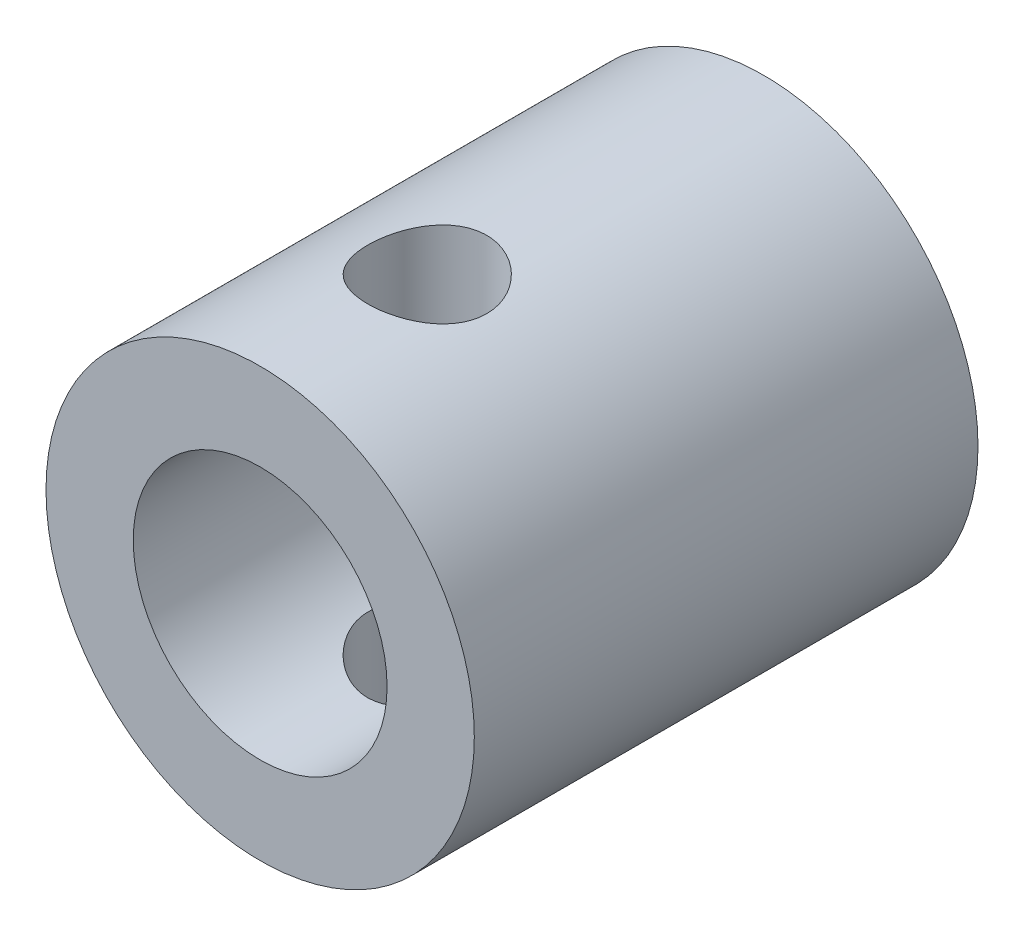
ISO-10303-21;
HEADER;
FILE_DESCRIPTION(('STEP AP214'),'2;1');
FILE_NAME('part.step','',(''),(''),'','','');
FILE_SCHEMA(('AUTOMOTIVE_DESIGN { 1 0 10303 214 1 1 1 1 }'));
ENDSEC;
DATA;
#1=APPLICATION_CONTEXT('core data for automotive mechanical design processes');
#2=APPLICATION_PROTOCOL_DEFINITION('international standard','automotive_design',2000,#1);
#3=PRODUCT_CONTEXT('',#1,'mechanical');
#4=PRODUCT('Part','Part','',(#3));
#5=PRODUCT_RELATED_PRODUCT_CATEGORY('part','',(#4));
#6=PRODUCT_DEFINITION_FORMATION('','',#4);
#7=PRODUCT_DEFINITION_CONTEXT('part definition',#1,'design');
#8=PRODUCT_DEFINITION('design','',#6,#7);
#9=PRODUCT_DEFINITION_SHAPE('','',#8);
#10=(LENGTH_UNIT() NAMED_UNIT(*) SI_UNIT(.MILLI.,.METRE.));
#11=(NAMED_UNIT(*) PLANE_ANGLE_UNIT() SI_UNIT($,.RADIAN.));
#12=(NAMED_UNIT(*) SI_UNIT($,.STERADIAN.) SOLID_ANGLE_UNIT());
#13=UNCERTAINTY_MEASURE_WITH_UNIT(LENGTH_MEASURE(1.E-05),#10,'distance_accuracy_value','');
#14=(GEOMETRIC_REPRESENTATION_CONTEXT(3) GLOBAL_UNCERTAINTY_ASSIGNED_CONTEXT((#13)) GLOBAL_UNIT_ASSIGNED_CONTEXT((#10,
#11,#12)) REPRESENTATION_CONTEXT('',''));
#15=CARTESIAN_POINT('',(0.,0.,0.));
#16=DIRECTION('',(0.,0.,1.));
#17=DIRECTION('',(1.,0.,0.));
#18=AXIS2_PLACEMENT_3D('',#15,#16,#17);
#19=CARTESIAN_POINT('',(0.,-7.3,8.48658298704663));
#20=DIRECTION('',(0.,1.,0.));
#21=DIRECTION('',(0.,0.,1.));
#22=AXIS2_PLACEMENT_3D('',#19,#20,#21);
#23=CYLINDRICAL_SURFACE('',#22,1.5);
#24=CARTESIAN_POINT('',(0.,-3.2,9.98658298704663));
#25=CARTESIAN_POINT('',(0.0794366297653684,-3.19999630571425,9.98657859762955));
#26=CARTESIAN_POINT('',(0.158985054285573,-3.19700957899868,9.98023563033916));
#27=CARTESIAN_POINT('',(0.315767144342182,-3.18535757334793,9.9551272387059));
#28=CARTESIAN_POINT('',(0.392995334806226,-3.17667982118131,9.93633452687561));
#29=CARTESIAN_POINT('',(0.542623613933924,-3.15456154654934,9.88720287511286));
#30=CARTESIAN_POINT('',(0.615040476822122,-3.14113872828529,9.85690682429573));
#31=CARTESIAN_POINT('',(0.753673316550171,-3.11079077785621,9.78583262694887));
#32=CARTESIAN_POINT('',(0.819890295729099,-3.09386621324576,9.7450561787975));
#33=CARTESIAN_POINT('',(0.948350357177736,-3.0570148530726,9.65160791480745));
#34=CARTESIAN_POINT('',(1.01017369872326,-3.03697404361317,9.5984046303423));
#35=CARTESIAN_POINT('',(1.12439785354931,-2.99656590387074,9.48274718235108));
#36=CARTESIAN_POINT('',(1.17679240559473,-2.97619836632648,9.42028692150968));
#37=CARTESIAN_POINT('',(1.27411857201607,-2.93591183357015,9.28292639416869));
#38=CARTESIAN_POINT('',(1.31833010930722,-2.91611100881908,9.20747737079306));
#39=CARTESIAN_POINT('',(1.39325151163875,-2.88107150479241,9.0491702464596));
#40=CARTESIAN_POINT('',(1.4239700636606,-2.86582989225174,8.96631695395662));
#41=CARTESIAN_POINT('',(1.46919263785962,-2.84290120635756,8.8003442664747));
#42=CARTESIAN_POINT('',(1.48450988794257,-2.83483816808474,8.71750075919955));
#43=CARTESIAN_POINT('',(1.50101060360856,-2.82613943112327,8.55005851367278));
#44=CARTESIAN_POINT('',(1.50220525058387,-2.82549785659326,8.46546121713348));
#45=CARTESIAN_POINT('',(1.49102860152934,-2.83140540410836,8.30615536176429));
#46=CARTESIAN_POINT('',(1.48002746065053,-2.83722835518323,8.23131767093712));
#47=CARTESIAN_POINT('',(1.44711565103968,-2.85415400915747,8.08470813173899));
#48=CARTESIAN_POINT('',(1.42520214213451,-2.86525808654715,8.01293708681023));
#49=CARTESIAN_POINT('',(1.37065958454468,-2.89175132581127,7.87249713925752));
#50=CARTESIAN_POINT('',(1.33779469146436,-2.90723355127044,7.80393819961885));
#51=CARTESIAN_POINT('',(1.26245573982023,-2.94073170962085,7.67299995113061));
#52=CARTESIAN_POINT('',(1.21997747050552,-2.95874875147367,7.61062336747961));
#53=CARTESIAN_POINT('',(1.12117144504836,-2.99768064068318,7.4866190219445));
#54=CARTESIAN_POINT('',(1.06383576537821,-3.01869659998738,7.42582348477215));
#55=CARTESIAN_POINT('',(0.939641687550932,-3.05963196112561,7.31438971395293));
#56=CARTESIAN_POINT('',(0.872779758723928,-3.07955095258331,7.2637552630959));
#57=CARTESIAN_POINT('',(0.728323977918189,-3.11693783151282,7.17238969383496));
#58=CARTESIAN_POINT('',(0.650429064841608,-3.13429076469825,7.13208385354987));
#59=CARTESIAN_POINT('',(0.487942227794179,-3.16365420400246,7.06545411614692));
#60=CARTESIAN_POINT('',(0.403355047372972,-3.1756684549702,7.03912041566845));
#61=CARTESIAN_POINT('',(0.236758036703878,-3.19224313378799,7.00312422039401));
#62=CARTESIAN_POINT('',(0.155037856315182,-3.19729898462949,6.99235058403384));
#63=CARTESIAN_POINT('',(-0.00919528809397418,-3.20103907716323,6.98436249527376));
#64=CARTESIAN_POINT('',(-0.0917079278381507,-3.199725822791,6.98714271434418));
#65=CARTESIAN_POINT('',(-0.24939802481789,-3.19117976213987,7.00547377568554));
#66=CARTESIAN_POINT('',(-0.324699508933727,-3.18434450990737,7.02016718145557));
#67=CARTESIAN_POINT('',(-0.471643871417133,-3.16591825802244,7.06062308724404));
#68=CARTESIAN_POINT('',(-0.543286322002911,-3.15432670372993,7.08638687821454));
#69=CARTESIAN_POINT('',(-0.683383574707803,-3.12701756569302,7.14902701364521));
#70=CARTESIAN_POINT('',(-0.751674047016101,-3.11118471264979,7.18621890593177));
#71=CARTESIAN_POINT('',(-0.88128616247221,-3.07698472270414,7.2703142066826));
#72=CARTESIAN_POINT('',(-0.94260472604946,-3.05861647375887,7.31722188110271));
#73=CARTESIAN_POINT('',(-1.06226746295268,-3.01925452981606,7.42423317365126));
#74=CARTESIAN_POINT('',(-1.11986840035393,-2.99817233580377,7.48513714815755));
#75=CARTESIAN_POINT('',(-1.22431969123982,-2.95705916335382,7.61592247354971));
#76=CARTESIAN_POINT('',(-1.27116477824616,-2.93702870357223,7.68580819623542));
#77=CARTESIAN_POINT('',(-1.35418065576862,-2.89971388021075,7.83561094429484));
#78=CARTESIAN_POINT('',(-1.38994353105744,-2.88254332558056,7.9157847171322));
#79=CARTESIAN_POINT('',(-1.4470971383464,-2.85428508393637,8.08208628516874));
#80=CARTESIAN_POINT('',(-1.46850394342155,-2.84319059671076,8.16820730222213));
#81=CARTESIAN_POINT('',(-1.49455896187422,-2.82957416856734,8.3355735824674));
#82=CARTESIAN_POINT('',(-1.50054972888926,-2.82636665307332,8.41655372663462));
#83=CARTESIAN_POINT('',(-1.49937130319663,-2.82699286139304,8.57837929532956));
#84=CARTESIAN_POINT('',(-1.49220590575928,-2.83082455454675,8.65922475197785));
#85=CARTESIAN_POINT('',(-1.46613131656595,-2.84440619852351,8.81221329236418));
#86=CARTESIAN_POINT('',(-1.44813274734754,-2.85369602866639,8.88455704202613));
#87=CARTESIAN_POINT('',(-1.40193210541393,-2.87667309849877,9.02516129959467));
#88=CARTESIAN_POINT('',(-1.37372698279688,-2.89036165246904,9.09342057987579));
#89=CARTESIAN_POINT('',(-1.30578840174151,-2.92171219398703,9.22890115493151));
#90=CARTESIAN_POINT('',(-1.26541393094301,-2.93957763369422,9.29575272283994));
#91=CARTESIAN_POINT('',(-1.17505974072646,-2.97684766005847,9.42214482454444));
#92=CARTESIAN_POINT('',(-1.12507549698614,-2.99625296915541,9.48168189291666));
#93=CARTESIAN_POINT('',(-1.01093776241371,-3.03677948258486,9.59802364103041));
#94=CARTESIAN_POINT('',(-0.945860595498028,-3.05787468390215,9.6539359653186));
#95=CARTESIAN_POINT('',(-0.806562992145147,-3.09753038570267,9.75418618212177));
#96=CARTESIAN_POINT('',(-0.732338206421693,-3.11608967155914,9.79851853738528));
#97=CARTESIAN_POINT('',(-0.576903485633841,-3.14856405697806,9.8738855416523));
#98=CARTESIAN_POINT('',(-0.49572795580457,-3.16250053665866,9.90498160226702));
#99=CARTESIAN_POINT('',(-0.328585281775291,-3.18419214255065,9.95271343261562));
#100=CARTESIAN_POINT('',(-0.242633177608916,-3.19196561184219,9.96939212650416));
#101=CARTESIAN_POINT('',(-0.129990114749172,-3.19746509257475,9.98116805437105));
#102=CARTESIAN_POINT('',(-0.104046547063509,-3.19841374704826,9.98319640960821));
#103=CARTESIAN_POINT('',(-0.052072659255267,-3.19968181283614,9.98590460940991));
#104=CARTESIAN_POINT('',(-0.0260423373483137,-3.20000121112686,9.98658442606388));
#105=CARTESIAN_POINT('',(0.,-3.2,9.98658298704663));
#106=B_SPLINE_CURVE_WITH_KNOTS('',3,(#24,#25,#26,#27,#28,#29,#30,#31,#32,#33,#34,#35,#36,#37,
#38,#39,#40,#41,#42,#43,#44,#45,#46,#47,#48,#49,#50,#51,#52,#53,#54,#55,#56,#57,#58,#59,#60,#61,
#62,#63,#64,#65,#66,#67,#68,#69,#70,#71,#72,#73,#74,#75,#76,#77,#78,#79,#80,#81,#82,#83,#84,#85,
#86,#87,#88,#89,#90,#91,#92,#93,#94,#95,#96,#97,#98,#99,#100,#101,#102,#103,#104,#105),
.UNSPECIFIED.,.T.,.F.,(4,2,2,2,2,2,2,2,2,2,2,2,2,2,2,2,2,2,2,2,2,2,2,2,2,2,2,2,2,2,2,2,2,2,2,2,
2,2,2,2,4),(0.,0.238203501088987,0.476930834285988,0.714776698722001,0.95258404383098,
1.20348916300413,1.45456028706044,1.72218974999842,1.98964665571214,2.24209356207648,
2.49434058339922,2.72088002998001,2.94747846905439,3.17931153510989,3.41124634347932,
3.6686152967309,3.92607988679166,4.1928727405001,4.45947815428198,4.70590077523508,
4.95222652601424,5.18224856612757,5.41229743710968,5.64937682702354,5.88656053405105,
6.14473054024122,6.40302668810358,6.66993374182532,6.93654146493568,7.1789957704764,
7.4213801441569,7.64578370611674,7.87025437934697,8.1096266208682,8.34911183707249,
8.6129314932358,8.87687707137173,9.13958432454605,9.40150671085486,9.47959722860009,
9.55768936255934),.UNSPECIFIED.);
#107=CARTESIAN_POINT('',(0.,-3.2,9.98658298704663));
#108=VERTEX_POINT('',#107);
#109=EDGE_CURVE('E36',#108,#108,#106,.T.);
#110=ORIENTED_EDGE('',*,*,#109,.T.);
#111=EDGE_LOOP('',(#110));
#112=FACE_BOUND('',#111,.T.);
#113=CARTESIAN_POINT('',(0.,-5.4,9.98658298704663));
#114=CARTESIAN_POINT('',(0.082561501059815,-5.39999889620314,9.98658130754436));
#115=CARTESIAN_POINT('',(0.1651405485032,-5.39808808904196,9.97974380328028));
#116=CARTESIAN_POINT('',(0.327911371193086,-5.39065140237886,9.95262811312825));
#117=CARTESIAN_POINT('',(0.408102124396127,-5.38512399779114,9.93234425699016));
#118=CARTESIAN_POINT('',(0.563723939616361,-5.37106278473503,9.87905252374993));
#119=CARTESIAN_POINT('',(0.639161268114802,-5.36253303637116,9.84606182460855));
#120=CARTESIAN_POINT('',(0.783432834290128,-5.34336375098435,9.76835877945438));
#121=CARTESIAN_POINT('',(0.852266484974763,-5.33272402666575,9.72364539274347));
#122=CARTESIAN_POINT('',(0.983096141659102,-5.31018189380835,9.62258766643525));
#123=CARTESIAN_POINT('',(1.04490373537014,-5.29825648347858,9.56600453942177));
#124=CARTESIAN_POINT('',(1.15828582283563,-5.27463128541284,9.44332345450053));
#125=CARTESIAN_POINT('',(1.20985887701474,-5.26293152962575,9.37722416031564));
#126=CARTESIAN_POINT('',(1.30224970296378,-5.24084453151262,9.23585427489218));
#127=CARTESIAN_POINT('',(1.34284649937368,-5.2304861752692,9.16043433691691));
#128=CARTESIAN_POINT('',(1.41070748557405,-5.21259480978224,9.00350468587575));
#129=CARTESIAN_POINT('',(1.43797436803628,-5.2050612299994,8.9219962065466));
#130=CARTESIAN_POINT('',(1.47773909241615,-5.19391059741305,8.75729964042328));
#131=CARTESIAN_POINT('',(1.49058044284924,-5.19020263092727,8.67420080109848));
#132=CARTESIAN_POINT('',(1.50220112493309,-5.1868517915112,8.5069519243954));
#133=CARTESIAN_POINT('',(1.50098332832776,-5.18720808840779,8.42280210519971));
#134=CARTESIAN_POINT('',(1.48479205605216,-5.19186440190074,8.25855625257777));
#135=CARTESIAN_POINT('',(1.47023882724825,-5.19604392809897,8.17841482525074));
#136=CARTESIAN_POINT('',(1.42846477442267,-5.20768220456576,8.02175863273715));
#137=CARTESIAN_POINT('',(1.40124286148584,-5.21514123671562,7.94524417992404));
#138=CARTESIAN_POINT('',(1.33457247761364,-5.23260083732974,7.79694030930018));
#139=CARTESIAN_POINT('',(1.29498026204391,-5.24263102320792,7.72521914687454));
#140=CARTESIAN_POINT('',(1.20479328815561,-5.26408740820604,7.58929309633717));
#141=CARTESIAN_POINT('',(1.15419619954872,-5.27551390277027,7.52508980457528));
#142=CARTESIAN_POINT('',(1.04130673234133,-5.2989728655235,7.40362633052292));
#143=CARTESIAN_POINT('',(0.978662735642829,-5.31101244045391,7.34669382519081));
#144=CARTESIAN_POINT('',(0.844567928641242,-5.33397839772952,7.24407211011326));
#145=CARTESIAN_POINT('',(0.773116710506358,-5.34490472848142,7.19838342132366));
#146=CARTESIAN_POINT('',(0.622900115205738,-5.36449007655318,7.11938480829054));
#147=CARTESIAN_POINT('',(0.544099674897298,-5.37313738374641,7.08613846231995));
#148=CARTESIAN_POINT('',(0.381731986523659,-5.38710591001732,7.03346206891699));
#149=CARTESIAN_POINT('',(0.298165876945357,-5.39242791988439,7.01402873645875));
#150=CARTESIAN_POINT('',(0.13143192925577,-5.39902483780091,6.99005442291186));
#151=CARTESIAN_POINT('',(0.0483327670304171,-5.40042064588836,6.98506841315803));
#152=CARTESIAN_POINT('',(-0.117515916763881,-5.39935776351791,6.98889538499755));
#153=CARTESIAN_POINT('',(-0.200265476741422,-5.39689950813801,6.99770680902429));
#154=CARTESIAN_POINT('',(-0.361448296165032,-5.38848318070834,7.02851498799019));
#155=CARTESIAN_POINT('',(-0.439933545796641,-5.38259204601097,7.05025972111566));
#156=CARTESIAN_POINT('',(-0.592131741742465,-5.36798195003225,7.10602122821235));
#157=CARTESIAN_POINT('',(-0.665844148766858,-5.35926266986156,7.14003938613004));
#158=CARTESIAN_POINT('',(-0.8081041684865,-5.3396848834101,7.22018204070242));
#159=CARTESIAN_POINT('',(-0.87651247434425,-5.32878565608678,7.26654361623383));
#160=CARTESIAN_POINT('',(-1.0047332047044,-5.30610572553855,7.36976235001559));
#161=CARTESIAN_POINT('',(-1.06454377755765,-5.29432483326227,7.42662176312555));
#162=CARTESIAN_POINT('',(-1.17577443233394,-5.27075811221255,7.55130471970065));
#163=CARTESIAN_POINT('',(-1.22687949462459,-5.25898329849552,7.61941192891571));
#164=CARTESIAN_POINT('',(-1.3169469771481,-5.2371563196512,7.76348775250231));
#165=CARTESIAN_POINT('',(-1.35590986178956,-5.22710408864596,7.83945606605775));
#166=CARTESIAN_POINT('',(-1.42029727000984,-5.20997758747408,7.99675159090643));
#167=CARTESIAN_POINT('',(-1.44579692981739,-5.20288683715248,8.0780461523522));
#168=CARTESIAN_POINT('',(-1.48269182994428,-5.1924945227134,8.24400263834675));
#169=CARTESIAN_POINT('',(-1.49409105487888,-5.18919188813864,8.32866360460637));
#170=CARTESIAN_POINT('',(-1.50221831969186,-5.1868444599585,8.49570992243557));
#171=CARTESIAN_POINT('',(-1.49945485217498,-5.18765208553412,8.57806881506096));
#172=CARTESIAN_POINT('',(-1.4805257194471,-5.19308564462548,8.74109685960025));
#173=CARTESIAN_POINT('',(-1.46436045659293,-5.1977114635091,8.82176606216852));
#174=CARTESIAN_POINT('',(-1.41939269098337,-5.21016862569603,8.97842366774831));
#175=CARTESIAN_POINT('',(-1.39070657569341,-5.2179704029593,9.05444799822394));
#176=CARTESIAN_POINT('',(-1.32160142004881,-5.23589899262465,9.20066389405542));
#177=CARTESIAN_POINT('',(-1.28118040030426,-5.24602619720885,9.27085447282946));
#178=CARTESIAN_POINT('',(-1.18824835442517,-5.26786572942455,9.40581617043684));
#179=CARTESIAN_POINT('',(-1.13539450121552,-5.27961814778714,9.4703447590659));
#180=CARTESIAN_POINT('',(-1.0197378329408,-5.30316998291235,9.58978183351078));
#181=CARTESIAN_POINT('',(-0.95693255475383,-5.31496941060373,9.64468793051581));
#182=CARTESIAN_POINT('',(-0.821352278769459,-5.33762207497858,9.74461275094033));
#183=CARTESIAN_POINT('',(-0.748375510718609,-5.3484460943135,9.78936493501945));
#184=CARTESIAN_POINT('',(-0.595634379231409,-5.36759969880726,9.865896754194));
#185=CARTESIAN_POINT('',(-0.515874036212069,-5.37593074842403,9.89768400934386));
#186=CARTESIAN_POINT('',(-0.363774580520039,-5.3881928979834,9.94364708392827));
#187=CARTESIAN_POINT('',(-0.292037282602488,-5.39258694794226,9.95970873215808));
#188=CARTESIAN_POINT('',(-0.14687115083209,-5.39849081971542,9.98117680203368));
#189=CARTESIAN_POINT('',(-0.0734425176232979,-5.40000098188162,9.98658448104654));
#190=CARTESIAN_POINT('',(0.,-5.4,9.98658298704663));
#191=B_SPLINE_CURVE_WITH_KNOTS('',3,(#113,#114,#115,#116,#117,#118,#119,#120,#121,#122,#123,
#124,#125,#126,#127,#128,#129,#130,#131,#132,#133,#134,#135,#136,#137,#138,#139,#140,#141,#142,
#143,#144,#145,#146,#147,#148,#149,#150,#151,#152,#153,#154,#155,#156,#157,#158,#159,#160,#161,
#162,#163,#164,#165,#166,#167,#168,#169,#170,#171,#172,#173,#174,#175,#176,#177,#178,#179,#180,
#181,#182,#183,#184,#185,#186,#187,#188,#189,#190),.UNSPECIFIED.,.T.,.F.,(4,2,2,2,2,2,2,2,2,2,2,
2,2,2,2,2,2,2,2,2,2,2,2,2,2,2,2,2,2,2,2,2,2,2,2,2,2,2,4),(0.,0.247415031719389,
0.494934463376713,0.742120449531425,0.989328387405518,1.24209149190317,1.49489012452794,
1.75245228388406,2.00996239360061,2.26120118329619,2.51238865546227,2.7559227959376,
2.99947787284238,3.24597552054041,3.49252541516464,3.74783392611048,4.00315426395029,
4.25976198768393,4.51630866425262,4.76486412711366,5.01339153303427,5.25722780978238,
5.501091590009,5.75002738666326,5.99901671526411,6.25567190048675,6.51231726807094,
6.7675147783002,7.02264015625974,7.26867119098423,7.51469483948312,7.75847872272484,
8.00230375023008,8.25386295933779,8.50548453053998,8.76309708706933,9.02055801451316,
9.2406718383529,9.46075968309975),.UNSPECIFIED.);
#192=CARTESIAN_POINT('',(0.,-5.4,9.98658298704663));
#193=VERTEX_POINT('',#192);
#194=EDGE_CURVE('E57',#193,#193,#191,.T.);
#195=ORIENTED_EDGE('',*,*,#194,.F.);
#196=EDGE_LOOP('',(#195));
#197=FACE_BOUND('',#196,.T.);
#198=ADVANCED_FACE('F31',(#112,#197),#23,.F.);
#199=CARTESIAN_POINT('',(0.,0.,12.7));
#200=DIRECTION('',(0.,0.,-1.));
#201=DIRECTION('',(-1.,0.,0.));
#202=AXIS2_PLACEMENT_3D('',#199,#200,#201);
#203=CYLINDRICAL_SURFACE('',#202,5.4);
#204=ORIENTED_EDGE('',*,*,#194,.T.);
#205=EDGE_LOOP('',(#204));
#206=FACE_BOUND('',#205,.T.);
#207=CARTESIAN_POINT('',(0.,5.4,9.98658298704663));
#208=CARTESIAN_POINT('',(-0.082561501059815,5.39999889620314,9.98658130754436));
#209=CARTESIAN_POINT('',(-0.1651405485032,5.39808808904196,9.97974380328028));
#210=CARTESIAN_POINT('',(-0.327911371193086,5.39065140237886,9.95262811312825));
#211=CARTESIAN_POINT('',(-0.408102124396127,5.38512399779114,9.93234425699016));
#212=CARTESIAN_POINT('',(-0.563723939616361,5.37106278473503,9.87905252374993));
#213=CARTESIAN_POINT('',(-0.639161268114802,5.36253303637116,9.84606182460855));
#214=CARTESIAN_POINT('',(-0.783432834290128,5.34336375098435,9.76835877945438));
#215=CARTESIAN_POINT('',(-0.852266484974763,5.33272402666575,9.72364539274347));
#216=CARTESIAN_POINT('',(-0.983096141659102,5.31018189380835,9.62258766643525));
#217=CARTESIAN_POINT('',(-1.04490373537014,5.29825648347858,9.56600453942177));
#218=CARTESIAN_POINT('',(-1.15828582283563,5.27463128541284,9.44332345450053));
#219=CARTESIAN_POINT('',(-1.20985887701474,5.26293152962575,9.37722416031564));
#220=CARTESIAN_POINT('',(-1.30224970296378,5.24084453151262,9.23585427489218));
#221=CARTESIAN_POINT('',(-1.34284649937368,5.2304861752692,9.16043433691691));
#222=CARTESIAN_POINT('',(-1.41070748557405,5.21259480978224,9.00350468587575));
#223=CARTESIAN_POINT('',(-1.43797436803628,5.2050612299994,8.9219962065466));
#224=CARTESIAN_POINT('',(-1.47773909241615,5.19391059741305,8.75729964042328));
#225=CARTESIAN_POINT('',(-1.49058044284924,5.19020263092727,8.67420080109848));
#226=CARTESIAN_POINT('',(-1.50220112493309,5.1868517915112,8.5069519243954));
#227=CARTESIAN_POINT('',(-1.50098332832776,5.18720808840779,8.42280210519971));
#228=CARTESIAN_POINT('',(-1.48479205605216,5.19186440190074,8.25855625257777));
#229=CARTESIAN_POINT('',(-1.47023882724825,5.19604392809897,8.17841482525074));
#230=CARTESIAN_POINT('',(-1.42846477442267,5.20768220456576,8.02175863273715));
#231=CARTESIAN_POINT('',(-1.40124286148584,5.21514123671562,7.94524417992404));
#232=CARTESIAN_POINT('',(-1.33457247761364,5.23260083732974,7.79694030930018));
#233=CARTESIAN_POINT('',(-1.29498026204391,5.24263102320792,7.72521914687454));
#234=CARTESIAN_POINT('',(-1.20479328815561,5.26408740820604,7.58929309633717));
#235=CARTESIAN_POINT('',(-1.15419619954872,5.27551390277027,7.52508980457528));
#236=CARTESIAN_POINT('',(-1.04130673234133,5.2989728655235,7.40362633052292));
#237=CARTESIAN_POINT('',(-0.978662735642829,5.31101244045391,7.34669382519081));
#238=CARTESIAN_POINT('',(-0.844567928641242,5.33397839772952,7.24407211011326));
#239=CARTESIAN_POINT('',(-0.773116710506358,5.34490472848142,7.19838342132366));
#240=CARTESIAN_POINT('',(-0.622900115205738,5.36449007655318,7.11938480829054));
#241=CARTESIAN_POINT('',(-0.544099674897298,5.37313738374641,7.08613846231995));
#242=CARTESIAN_POINT('',(-0.381731986523659,5.38710591001732,7.03346206891699));
#243=CARTESIAN_POINT('',(-0.298165876945357,5.39242791988439,7.01402873645875));
#244=CARTESIAN_POINT('',(-0.13143192925577,5.39902483780091,6.99005442291186));
#245=CARTESIAN_POINT('',(-0.0483327670304171,5.40042064588836,6.98506841315803));
#246=CARTESIAN_POINT('',(0.117515916763881,5.39935776351791,6.98889538499755));
#247=CARTESIAN_POINT('',(0.200265476741422,5.39689950813801,6.99770680902429));
#248=CARTESIAN_POINT('',(0.361448296165032,5.38848318070834,7.02851498799019));
#249=CARTESIAN_POINT('',(0.439933545796641,5.38259204601097,7.05025972111566));
#250=CARTESIAN_POINT('',(0.592131741742465,5.36798195003225,7.10602122821235));
#251=CARTESIAN_POINT('',(0.665844148766858,5.35926266986156,7.14003938613004));
#252=CARTESIAN_POINT('',(0.8081041684865,5.3396848834101,7.22018204070242));
#253=CARTESIAN_POINT('',(0.87651247434425,5.32878565608678,7.26654361623383));
#254=CARTESIAN_POINT('',(1.0047332047044,5.30610572553855,7.36976235001559));
#255=CARTESIAN_POINT('',(1.06454377755765,5.29432483326227,7.42662176312555));
#256=CARTESIAN_POINT('',(1.17577443233394,5.27075811221255,7.55130471970065));
#257=CARTESIAN_POINT('',(1.22687949462459,5.25898329849552,7.61941192891571));
#258=CARTESIAN_POINT('',(1.3169469771481,5.2371563196512,7.76348775250231));
#259=CARTESIAN_POINT('',(1.35590986178956,5.22710408864596,7.83945606605775));
#260=CARTESIAN_POINT('',(1.42029727000984,5.20997758747408,7.99675159090643));
#261=CARTESIAN_POINT('',(1.44579692981739,5.20288683715248,8.0780461523522));
#262=CARTESIAN_POINT('',(1.48269182994428,5.1924945227134,8.24400263834675));
#263=CARTESIAN_POINT('',(1.49409105487888,5.18919188813864,8.32866360460637));
#264=CARTESIAN_POINT('',(1.50221831969186,5.1868444599585,8.49570992243557));
#265=CARTESIAN_POINT('',(1.49945485217498,5.18765208553412,8.57806881506096));
#266=CARTESIAN_POINT('',(1.4805257194471,5.19308564462548,8.74109685960025));
#267=CARTESIAN_POINT('',(1.46436045659293,5.1977114635091,8.82176606216852));
#268=CARTESIAN_POINT('',(1.41939269098337,5.21016862569603,8.97842366774831));
#269=CARTESIAN_POINT('',(1.39070657569341,5.2179704029593,9.05444799822394));
#270=CARTESIAN_POINT('',(1.32160142004881,5.23589899262465,9.20066389405542));
#271=CARTESIAN_POINT('',(1.28118040030426,5.24602619720885,9.27085447282946));
#272=CARTESIAN_POINT('',(1.18824835442517,5.26786572942455,9.40581617043684));
#273=CARTESIAN_POINT('',(1.13539450121552,5.27961814778714,9.4703447590659));
#274=CARTESIAN_POINT('',(1.0197378329408,5.30316998291235,9.58978183351078));
#275=CARTESIAN_POINT('',(0.95693255475383,5.31496941060373,9.64468793051581));
#276=CARTESIAN_POINT('',(0.821352278769459,5.33762207497858,9.74461275094033));
#277=CARTESIAN_POINT('',(0.748375510718609,5.3484460943135,9.78936493501945));
#278=CARTESIAN_POINT('',(0.595634379231409,5.36759969880726,9.865896754194));
#279=CARTESIAN_POINT('',(0.515874036212069,5.37593074842403,9.89768400934386));
#280=CARTESIAN_POINT('',(0.363774580520039,5.3881928979834,9.94364708392827));
#281=CARTESIAN_POINT('',(0.292037282602488,5.39258694794226,9.95970873215808));
#282=CARTESIAN_POINT('',(0.14687115083209,5.39849081971542,9.98117680203368));
#283=CARTESIAN_POINT('',(0.0734425176232979,5.40000098188162,9.98658448104654));
#284=CARTESIAN_POINT('',(0.,5.4,9.98658298704663));
#285=B_SPLINE_CURVE_WITH_KNOTS('',3,(#207,#208,#209,#210,#211,#212,#213,#214,#215,#216,#217,
#218,#219,#220,#221,#222,#223,#224,#225,#226,#227,#228,#229,#230,#231,#232,#233,#234,#235,#236,
#237,#238,#239,#240,#241,#242,#243,#244,#245,#246,#247,#248,#249,#250,#251,#252,#253,#254,#255,
#256,#257,#258,#259,#260,#261,#262,#263,#264,#265,#266,#267,#268,#269,#270,#271,#272,#273,#274,
#275,#276,#277,#278,#279,#280,#281,#282,#283,#284),.UNSPECIFIED.,.T.,.F.,(4,2,2,2,2,2,2,2,2,2,2,
2,2,2,2,2,2,2,2,2,2,2,2,2,2,2,2,2,2,2,2,2,2,2,2,2,2,2,4),(0.,0.247415031719389,
0.494934463376713,0.742120449531425,0.989328387405518,1.24209149190317,1.49489012452794,
1.75245228388406,2.00996239360061,2.26120118329619,2.51238865546227,2.7559227959376,
2.99947787284238,3.24597552054041,3.49252541516464,3.74783392611048,4.00315426395029,
4.25976198768393,4.51630866425262,4.76486412711366,5.01339153303427,5.25722780978238,
5.501091590009,5.75002738666326,5.99901671526411,6.25567190048675,6.51231726807094,
6.7675147783002,7.02264015625974,7.26867119098423,7.51469483948312,7.75847872272484,
8.00230375023008,8.25386295933779,8.50548453053998,8.76309708706933,9.02055801451316,
9.2406718383529,9.46075968309975),.UNSPECIFIED.);
#286=CARTESIAN_POINT('',(0.,5.4,9.98658298704663));
#287=VERTEX_POINT('',#286);
#288=EDGE_CURVE('E10',#287,#287,#285,.T.);
#289=ORIENTED_EDGE('',*,*,#288,.T.);
#290=EDGE_LOOP('',(#289));
#291=FACE_BOUND('',#290,.T.);
#292=CARTESIAN_POINT('',(0.,0.,12.7));
#293=DIRECTION('',(0.,0.,1.));
#294=DIRECTION('',(1.,0.,0.));
#295=AXIS2_PLACEMENT_3D('',#292,#293,#294);
#296=CIRCLE('',#295,5.4);
#297=CARTESIAN_POINT('',(5.4,0.,12.7));
#298=VERTEX_POINT('',#297);
#299=EDGE_CURVE('E45',#298,#298,#296,.T.);
#300=ORIENTED_EDGE('',*,*,#299,.F.);
#301=EDGE_LOOP('',(#300));
#302=FACE_BOUND('',#301,.T.);
#303=CARTESIAN_POINT('',(0.,0.,0.));
#304=DIRECTION('',(0.,0.,1.));
#305=DIRECTION('',(1.,0.,0.));
#306=AXIS2_PLACEMENT_3D('',#303,#304,#305);
#307=CIRCLE('',#306,5.4);
#308=CARTESIAN_POINT('',(5.4,0.,0.));
#309=VERTEX_POINT('',#308);
#310=EDGE_CURVE('E50',#309,#309,#307,.T.);
#311=ORIENTED_EDGE('',*,*,#310,.T.);
#312=EDGE_LOOP('',(#311));
#313=FACE_BOUND('',#312,.T.);
#314=ADVANCED_FACE('F33',(#206,#291,#302,#313),#203,.T.);
#315=CARTESIAN_POINT('',(0.,0.,12.7));
#316=DIRECTION('',(0.,0.,1.));
#317=DIRECTION('',(1.,0.,0.));
#318=AXIS2_PLACEMENT_3D('',#315,#316,#317);
#319=PLANE('',#318);
#320=CARTESIAN_POINT('',(0.,0.,12.7));
#321=DIRECTION('',(0.,0.,1.));
#322=DIRECTION('',(1.,0.,0.));
#323=AXIS2_PLACEMENT_3D('',#320,#321,#322);
#324=CIRCLE('',#323,3.2);
#325=CARTESIAN_POINT('',(3.2,0.,12.7));
#326=VERTEX_POINT('',#325);
#327=EDGE_CURVE('E115',#326,#326,#324,.T.);
#328=ORIENTED_EDGE('',*,*,#327,.F.);
#329=EDGE_LOOP('',(#328));
#330=FACE_BOUND('',#329,.T.);
#331=ORIENTED_EDGE('',*,*,#299,.T.);
#332=EDGE_LOOP('',(#331));
#333=FACE_BOUND('',#332,.T.);
#334=ADVANCED_FACE('F69',(#330,#333),#319,.T.);
#335=CARTESIAN_POINT('',(0.,0.,0.));
#336=DIRECTION('',(0.,0.,1.));
#337=DIRECTION('',(1.,0.,0.));
#338=AXIS2_PLACEMENT_3D('',#335,#336,#337);
#339=PLANE('',#338);
#340=CARTESIAN_POINT('',(0.,0.,0.));
#341=DIRECTION('',(0.,0.,-1.));
#342=DIRECTION('',(-1.,0.,0.));
#343=AXIS2_PLACEMENT_3D('',#340,#341,#342);
#344=CIRCLE('',#343,2.25);
#345=CARTESIAN_POINT('',(-2.25,0.,0.));
#346=VERTEX_POINT('',#345);
#347=EDGE_CURVE('E105',#346,#346,#344,.T.);
#348=ORIENTED_EDGE('',*,*,#347,.F.);
#349=EDGE_LOOP('',(#348));
#350=FACE_BOUND('',#349,.T.);
#351=ORIENTED_EDGE('',*,*,#310,.F.);
#352=EDGE_LOOP('',(#351));
#353=FACE_BOUND('',#352,.T.);
#354=ADVANCED_FACE('F67',(#350,#353),#339,.F.);
#355=CARTESIAN_POINT('',(0.,3.2,9.98658298704663));
#356=CARTESIAN_POINT('',(-0.0794366297653684,3.19999630571425,9.98657859762955));
#357=CARTESIAN_POINT('',(-0.158985054285573,3.19700957899868,9.98023563033916));
#358=CARTESIAN_POINT('',(-0.315767144342182,3.18535757334793,9.9551272387059));
#359=CARTESIAN_POINT('',(-0.392995334806226,3.17667982118131,9.93633452687561));
#360=CARTESIAN_POINT('',(-0.542623613933924,3.15456154654934,9.88720287511286));
#361=CARTESIAN_POINT('',(-0.615040476822122,3.14113872828529,9.85690682429573));
#362=CARTESIAN_POINT('',(-0.753673316550171,3.11079077785621,9.78583262694887));
#363=CARTESIAN_POINT('',(-0.819890295729099,3.09386621324576,9.7450561787975));
#364=CARTESIAN_POINT('',(-0.948350357177736,3.0570148530726,9.65160791480745));
#365=CARTESIAN_POINT('',(-1.01017369872326,3.03697404361317,9.5984046303423));
#366=CARTESIAN_POINT('',(-1.12439785354931,2.99656590387074,9.48274718235108));
#367=CARTESIAN_POINT('',(-1.17679240559473,2.97619836632648,9.42028692150968));
#368=CARTESIAN_POINT('',(-1.27411857201607,2.93591183357015,9.28292639416869));
#369=CARTESIAN_POINT('',(-1.31833010930722,2.91611100881908,9.20747737079306));
#370=CARTESIAN_POINT('',(-1.39325151163875,2.88107150479241,9.0491702464596));
#371=CARTESIAN_POINT('',(-1.4239700636606,2.86582989225174,8.96631695395662));
#372=CARTESIAN_POINT('',(-1.46919263785962,2.84290120635756,8.8003442664747));
#373=CARTESIAN_POINT('',(-1.48450988794257,2.83483816808474,8.71750075919955));
#374=CARTESIAN_POINT('',(-1.50101060360856,2.82613943112327,8.55005851367278));
#375=CARTESIAN_POINT('',(-1.50220525058387,2.82549785659326,8.46546121713348));
#376=CARTESIAN_POINT('',(-1.49102860152934,2.83140540410836,8.30615536176429));
#377=CARTESIAN_POINT('',(-1.48002746065053,2.83722835518323,8.23131767093712));
#378=CARTESIAN_POINT('',(-1.44711565103968,2.85415400915747,8.08470813173899));
#379=CARTESIAN_POINT('',(-1.42520214213451,2.86525808654715,8.01293708681023));
#380=CARTESIAN_POINT('',(-1.37065958454468,2.89175132581127,7.87249713925752));
#381=CARTESIAN_POINT('',(-1.33779469146436,2.90723355127044,7.80393819961885));
#382=CARTESIAN_POINT('',(-1.26245573982023,2.94073170962085,7.67299995113061));
#383=CARTESIAN_POINT('',(-1.21997747050552,2.95874875147367,7.61062336747961));
#384=CARTESIAN_POINT('',(-1.12117144504836,2.99768064068318,7.4866190219445));
#385=CARTESIAN_POINT('',(-1.06383576537821,3.01869659998738,7.42582348477215));
#386=CARTESIAN_POINT('',(-0.939641687550932,3.05963196112561,7.31438971395293));
#387=CARTESIAN_POINT('',(-0.872779758723928,3.07955095258331,7.2637552630959));
#388=CARTESIAN_POINT('',(-0.728323977918189,3.11693783151282,7.17238969383496));
#389=CARTESIAN_POINT('',(-0.650429064841608,3.13429076469825,7.13208385354987));
#390=CARTESIAN_POINT('',(-0.487942227794179,3.16365420400246,7.06545411614692));
#391=CARTESIAN_POINT('',(-0.403355047372972,3.1756684549702,7.03912041566845));
#392=CARTESIAN_POINT('',(-0.236758036703878,3.19224313378799,7.00312422039401));
#393=CARTESIAN_POINT('',(-0.155037856315182,3.19729898462949,6.99235058403384));
#394=CARTESIAN_POINT('',(0.00919528809397418,3.20103907716323,6.98436249527376));
#395=CARTESIAN_POINT('',(0.0917079278381507,3.199725822791,6.98714271434418));
#396=CARTESIAN_POINT('',(0.24939802481789,3.19117976213987,7.00547377568554));
#397=CARTESIAN_POINT('',(0.324699508933727,3.18434450990737,7.02016718145557));
#398=CARTESIAN_POINT('',(0.471643871417133,3.16591825802244,7.06062308724404));
#399=CARTESIAN_POINT('',(0.543286322002911,3.15432670372993,7.08638687821454));
#400=CARTESIAN_POINT('',(0.683383574707803,3.12701756569302,7.14902701364521));
#401=CARTESIAN_POINT('',(0.751674047016101,3.11118471264979,7.18621890593177));
#402=CARTESIAN_POINT('',(0.88128616247221,3.07698472270414,7.2703142066826));
#403=CARTESIAN_POINT('',(0.94260472604946,3.05861647375887,7.31722188110271));
#404=CARTESIAN_POINT('',(1.06226746295268,3.01925452981606,7.42423317365126));
#405=CARTESIAN_POINT('',(1.11986840035393,2.99817233580377,7.48513714815755));
#406=CARTESIAN_POINT('',(1.22431969123982,2.95705916335382,7.61592247354971));
#407=CARTESIAN_POINT('',(1.27116477824616,2.93702870357223,7.68580819623542));
#408=CARTESIAN_POINT('',(1.35418065576862,2.89971388021075,7.83561094429484));
#409=CARTESIAN_POINT('',(1.38994353105744,2.88254332558056,7.9157847171322));
#410=CARTESIAN_POINT('',(1.4470971383464,2.85428508393637,8.08208628516874));
#411=CARTESIAN_POINT('',(1.46850394342155,2.84319059671076,8.16820730222213));
#412=CARTESIAN_POINT('',(1.49455896187422,2.82957416856734,8.3355735824674));
#413=CARTESIAN_POINT('',(1.50054972888926,2.82636665307332,8.41655372663462));
#414=CARTESIAN_POINT('',(1.49937130319663,2.82699286139304,8.57837929532956));
#415=CARTESIAN_POINT('',(1.49220590575928,2.83082455454675,8.65922475197785));
#416=CARTESIAN_POINT('',(1.46613131656595,2.84440619852351,8.81221329236418));
#417=CARTESIAN_POINT('',(1.44813274734754,2.85369602866639,8.88455704202613));
#418=CARTESIAN_POINT('',(1.40193210541393,2.87667309849877,9.02516129959467));
#419=CARTESIAN_POINT('',(1.37372698279688,2.89036165246904,9.09342057987579));
#420=CARTESIAN_POINT('',(1.30578840174151,2.92171219398703,9.22890115493151));
#421=CARTESIAN_POINT('',(1.26541393094301,2.93957763369422,9.29575272283994));
#422=CARTESIAN_POINT('',(1.17505974072646,2.97684766005847,9.42214482454444));
#423=CARTESIAN_POINT('',(1.12507549698614,2.99625296915541,9.48168189291666));
#424=CARTESIAN_POINT('',(1.01093776241371,3.03677948258486,9.59802364103041));
#425=CARTESIAN_POINT('',(0.945860595498028,3.05787468390215,9.6539359653186));
#426=CARTESIAN_POINT('',(0.806562992145147,3.09753038570267,9.75418618212177));
#427=CARTESIAN_POINT('',(0.732338206421693,3.11608967155914,9.79851853738528));
#428=CARTESIAN_POINT('',(0.576903485633841,3.14856405697806,9.8738855416523));
#429=CARTESIAN_POINT('',(0.49572795580457,3.16250053665866,9.90498160226702));
#430=CARTESIAN_POINT('',(0.328585281775291,3.18419214255065,9.95271343261562));
#431=CARTESIAN_POINT('',(0.242633177608916,3.19196561184219,9.96939212650416));
#432=CARTESIAN_POINT('',(0.129990114749172,3.19746509257475,9.98116805437105));
#433=CARTESIAN_POINT('',(0.104046547063509,3.19841374704826,9.98319640960821));
#434=CARTESIAN_POINT('',(0.052072659255267,3.19968181283614,9.98590460940991));
#435=CARTESIAN_POINT('',(0.0260423373483137,3.20000121112686,9.98658442606388));
#436=CARTESIAN_POINT('',(0.,3.2,9.98658298704663));
#437=B_SPLINE_CURVE_WITH_KNOTS('',3,(#355,#356,#357,#358,#359,#360,#361,#362,#363,#364,#365,
#366,#367,#368,#369,#370,#371,#372,#373,#374,#375,#376,#377,#378,#379,#380,#381,#382,#383,#384,
#385,#386,#387,#388,#389,#390,#391,#392,#393,#394,#395,#396,#397,#398,#399,#400,#401,#402,#403,
#404,#405,#406,#407,#408,#409,#410,#411,#412,#413,#414,#415,#416,#417,#418,#419,#420,#421,#422,
#423,#424,#425,#426,#427,#428,#429,#430,#431,#432,#433,#434,#435,#436),.UNSPECIFIED.,.T.,.F.,(4,
2,2,2,2,2,2,2,2,2,2,2,2,2,2,2,2,2,2,2,2,2,2,2,2,2,2,2,2,2,2,2,2,2,2,2,2,2,2,2,4),(0.,
0.238203501088987,0.476930834285988,0.714776698722001,0.95258404383098,1.20348916300413,
1.45456028706044,1.72218974999842,1.98964665571214,2.24209356207648,2.49434058339922,
2.72088002998001,2.94747846905439,3.17931153510989,3.41124634347932,3.6686152967309,
3.92607988679166,4.1928727405001,4.45947815428198,4.70590077523508,4.95222652601424,
5.18224856612757,5.41229743710968,5.64937682702354,5.88656053405105,6.14473054024122,
6.40302668810358,6.66993374182532,6.93654146493568,7.1789957704764,7.4213801441569,
7.64578370611674,7.87025437934697,8.1096266208682,8.34911183707249,8.6129314932358,
8.87687707137173,9.13958432454605,9.40150671085486,9.47959722860009,9.55768936255934),.UNSPECIFIED.);
#438=CARTESIAN_POINT('',(0.,3.2,9.98658298704663));
#439=VERTEX_POINT('',#438);
#440=EDGE_CURVE('E73',#439,#439,#437,.T.);
#441=ORIENTED_EDGE('',*,*,#440,.T.);
#442=EDGE_LOOP('',(#441));
#443=FACE_BOUND('',#442,.T.);
#444=ORIENTED_EDGE('',*,*,#288,.F.);
#445=EDGE_LOOP('',(#444));
#446=FACE_BOUND('',#445,.T.);
#447=ADVANCED_FACE('F61',(#443,#446),#23,.F.);
#448=CARTESIAN_POINT('',(0.,0.,3.5));
#449=DIRECTION('',(0.,0.,-1.));
#450=DIRECTION('',(-1.,0.,0.));
#451=AXIS2_PLACEMENT_3D('',#448,#449,#450);
#452=CYLINDRICAL_SURFACE('',#451,2.25);
#453=CARTESIAN_POINT('',(0.,0.,3.5));
#454=DIRECTION('',(0.,0.,-1.));
#455=DIRECTION('',(-1.,0.,0.));
#456=AXIS2_PLACEMENT_3D('',#453,#454,#455);
#457=CIRCLE('',#456,2.25);
#458=CARTESIAN_POINT('',(-2.25,0.,3.5));
#459=VERTEX_POINT('',#458);
#460=EDGE_CURVE('E108',#459,#459,#457,.T.);
#461=ORIENTED_EDGE('',*,*,#460,.F.);
#462=EDGE_LOOP('',(#461));
#463=FACE_BOUND('',#462,.T.);
#464=ORIENTED_EDGE('',*,*,#347,.T.);
#465=EDGE_LOOP('',(#464));
#466=FACE_BOUND('',#465,.T.);
#467=ADVANCED_FACE('F66',(#463,#466),#452,.F.);
#468=CARTESIAN_POINT('',(0.,0.,3.5));
#469=DIRECTION('',(0.,0.,1.));
#470=DIRECTION('',(1.,0.,0.));
#471=AXIS2_PLACEMENT_3D('',#468,#469,#470);
#472=PLANE('',#471);
#473=CARTESIAN_POINT('',(0.,0.,3.5));
#474=DIRECTION('',(0.,0.,1.));
#475=DIRECTION('',(1.,0.,0.));
#476=AXIS2_PLACEMENT_3D('',#473,#474,#475);
#477=CIRCLE('',#476,3.2);
#478=CARTESIAN_POINT('',(3.2,0.,3.5));
#479=VERTEX_POINT('',#478);
#480=EDGE_CURVE('E78',#479,#479,#477,.T.);
#481=ORIENTED_EDGE('',*,*,#480,.T.);
#482=EDGE_LOOP('',(#481));
#483=FACE_BOUND('',#482,.T.);
#484=ORIENTED_EDGE('',*,*,#460,.T.);
#485=EDGE_LOOP('',(#484));
#486=FACE_BOUND('',#485,.T.);
#487=ADVANCED_FACE('F83',(#483,#486),#472,.T.);
#488=CARTESIAN_POINT('',(0.,0.,3.5));
#489=DIRECTION('',(0.,0.,1.));
#490=DIRECTION('',(1.,0.,0.));
#491=AXIS2_PLACEMENT_3D('',#488,#489,#490);
#492=CYLINDRICAL_SURFACE('',#491,3.2);
#493=ORIENTED_EDGE('',*,*,#440,.F.);
#494=EDGE_LOOP('',(#493));
#495=FACE_BOUND('',#494,.T.);
#496=ORIENTED_EDGE('',*,*,#480,.F.);
#497=EDGE_LOOP('',(#496));
#498=FACE_BOUND('',#497,.T.);
#499=ORIENTED_EDGE('',*,*,#327,.T.);
#500=EDGE_LOOP('',(#499));
#501=FACE_BOUND('',#500,.T.);
#502=ORIENTED_EDGE('',*,*,#109,.F.);
#503=EDGE_LOOP('',(#502));
#504=FACE_BOUND('',#503,.T.);
#505=ADVANCED_FACE('F79',(#495,#498,#501,#504),#492,.F.);
#506=CLOSED_SHELL('',(#198,#314,#334,#354,#447,#467,#487,#505));
#507=MANIFOLD_SOLID_BREP('B2',#506);
#508=ADVANCED_BREP_SHAPE_REPRESENTATION('',(#18,#507),#14);
#509=SHAPE_DEFINITION_REPRESENTATION(#9,#508);
ENDSEC;
END-ISO-10303-21;
